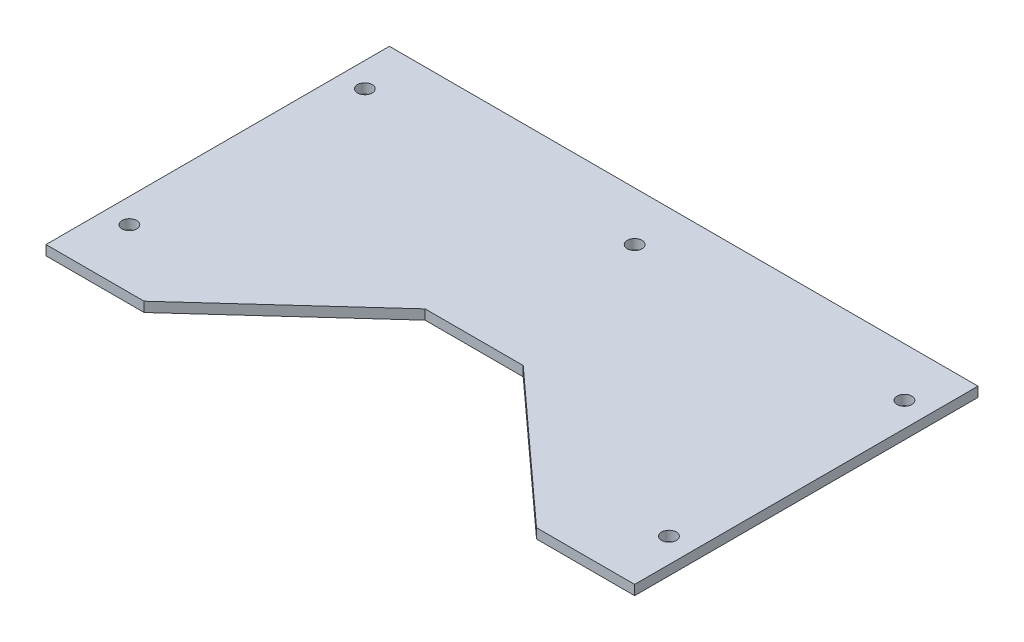
ISO-10303-21;
HEADER;
FILE_DESCRIPTION(('STEP AP214'),'2;1');
FILE_NAME('part.step','',(''),(''),'','','');
FILE_SCHEMA(('AUTOMOTIVE_DESIGN { 1 0 10303 214 1 1 1 1 }'));
ENDSEC;
DATA;
#1=APPLICATION_CONTEXT('core data for automotive mechanical design processes');
#2=APPLICATION_PROTOCOL_DEFINITION('international standard','automotive_design',2000,#1);
#3=PRODUCT_CONTEXT('',#1,'mechanical');
#4=PRODUCT('Part','Part','',(#3));
#5=PRODUCT_RELATED_PRODUCT_CATEGORY('part','',(#4));
#6=PRODUCT_DEFINITION_FORMATION('','',#4);
#7=PRODUCT_DEFINITION_CONTEXT('part definition',#1,'design');
#8=PRODUCT_DEFINITION('design','',#6,#7);
#9=PRODUCT_DEFINITION_SHAPE('','',#8);
#10=(LENGTH_UNIT() NAMED_UNIT(*) SI_UNIT(.MILLI.,.METRE.));
#11=(NAMED_UNIT(*) PLANE_ANGLE_UNIT() SI_UNIT($,.RADIAN.));
#12=(NAMED_UNIT(*) SI_UNIT($,.STERADIAN.) SOLID_ANGLE_UNIT());
#13=UNCERTAINTY_MEASURE_WITH_UNIT(LENGTH_MEASURE(1.E-05),#10,'distance_accuracy_value','');
#14=(GEOMETRIC_REPRESENTATION_CONTEXT(3) GLOBAL_UNCERTAINTY_ASSIGNED_CONTEXT((#13)) GLOBAL_UNIT_ASSIGNED_CONTEXT((#10,
#11,#12)) REPRESENTATION_CONTEXT('',''));
#15=CARTESIAN_POINT('',(0.,0.,0.));
#16=DIRECTION('',(0.,0.,1.));
#17=DIRECTION('',(1.,0.,0.));
#18=AXIS2_PLACEMENT_3D('',#15,#16,#17);
#19=CARTESIAN_POINT('',(0.,1.27,0.));
#20=DIRECTION('',(0.,-1.,0.));
#21=DIRECTION('',(0.,0.,-1.));
#22=AXIS2_PLACEMENT_3D('',#19,#20,#21);
#23=PLANE('',#22);
#24=CARTESIAN_POINT('',(69.85,1.27,33.8700806451613));
#25=DIRECTION('',(0.,1.,0.));
#26=DIRECTION('',(0.,0.,1.));
#27=AXIS2_PLACEMENT_3D('',#24,#25,#26);
#28=CIRCLE('',#27,1.90500000000001);
#29=CARTESIAN_POINT('',(69.85,1.27,35.7750806451613));
#30=VERTEX_POINT('',#29);
#31=EDGE_CURVE('E196',#30,#30,#28,.T.);
#32=ORIENTED_EDGE('',*,*,#31,.F.);
#33=EDGE_LOOP('',(#32));
#34=FACE_BOUND('',#33,.T.);
#35=CARTESIAN_POINT('',(0.,1.27,-27.0899193548382));
#36=DIRECTION('',(0.,1.,0.));
#37=DIRECTION('',(0.,0.,1.));
#38=AXIS2_PLACEMENT_3D('',#35,#36,#37);
#39=CIRCLE('',#38,1.90500000000001);
#40=CARTESIAN_POINT('',(0.,1.27,-25.1849193548382));
#41=VERTEX_POINT('',#40);
#42=EDGE_CURVE('E184',#41,#41,#39,.T.);
#43=ORIENTED_EDGE('',*,*,#42,.F.);
#44=EDGE_LOOP('',(#43));
#45=FACE_BOUND('',#44,.T.);
#46=DIRECTION('',(0.,0.,1.));
#47=VECTOR('',#46,1.);
#48=CARTESIAN_POINT('',(-76.2,1.27,49.1100806451613));
#49=LINE('',#48,#47);
#50=CARTESIAN_POINT('',(-76.2,1.27,-39.7899193548387));
#51=VERTEX_POINT('',#50);
#52=CARTESIAN_POINT('',(-76.2,1.27,49.1100806451613));
#53=VERTEX_POINT('',#52);
#54=EDGE_CURVE('E147',#51,#53,#49,.T.);
#55=ORIENTED_EDGE('',*,*,#54,.T.);
#56=DIRECTION('',(1.,0.,0.));
#57=VECTOR('',#56,1.);
#58=CARTESIAN_POINT('',(-50.8,1.27,49.1100806451613));
#59=LINE('',#58,#57);
#60=CARTESIAN_POINT('',(-50.8,1.27,49.1100806451613));
#61=VERTEX_POINT('',#60);
#62=EDGE_CURVE('E95',#53,#61,#59,.T.);
#63=ORIENTED_EDGE('',*,*,#62,.T.);
#64=DIRECTION('',(0.739790078910943,0.,-0.67283775098083));
#65=VECTOR('',#64,1.);
#66=CARTESIAN_POINT('',(-12.7,1.27,14.4581989247312));
#67=LINE('',#66,#65);
#68=CARTESIAN_POINT('',(-12.7,1.27,14.4581989247312));
#69=VERTEX_POINT('',#68);
#70=EDGE_CURVE('E162',#61,#69,#67,.T.);
#71=ORIENTED_EDGE('',*,*,#70,.T.);
#72=DIRECTION('',(1.,0.,0.));
#73=VECTOR('',#72,1.);
#74=CARTESIAN_POINT('',(12.7,1.27,14.4581989247312));
#75=LINE('',#74,#73);
#76=CARTESIAN_POINT('',(12.7,1.27,14.4581989247312));
#77=VERTEX_POINT('',#76);
#78=EDGE_CURVE('E175',#69,#77,#75,.T.);
#79=ORIENTED_EDGE('',*,*,#78,.T.);
#80=DIRECTION('',(0.739790078910943,0.,0.67283775098083));
#81=VECTOR('',#80,1.);
#82=CARTESIAN_POINT('',(50.8,1.27,49.1100806451613));
#83=LINE('',#82,#81);
#84=CARTESIAN_POINT('',(50.8,1.27,49.1100806451613));
#85=VERTEX_POINT('',#84);
#86=EDGE_CURVE('E114',#77,#85,#83,.T.);
#87=ORIENTED_EDGE('',*,*,#86,.T.);
#88=DIRECTION('',(1.,0.,0.));
#89=VECTOR('',#88,1.);
#90=CARTESIAN_POINT('',(76.2,1.27,49.1100806451613));
#91=LINE('',#90,#89);
#92=CARTESIAN_POINT('',(76.2,1.27,49.1100806451613));
#93=VERTEX_POINT('',#92);
#94=EDGE_CURVE('E108',#85,#93,#91,.T.);
#95=ORIENTED_EDGE('',*,*,#94,.T.);
#96=DIRECTION('',(0.,0.,-1.));
#97=VECTOR('',#96,1.);
#98=CARTESIAN_POINT('',(76.2,1.27,-39.7899193548387));
#99=LINE('',#98,#97);
#100=CARTESIAN_POINT('',(76.2,1.27,-39.7899193548387));
#101=VERTEX_POINT('',#100);
#102=EDGE_CURVE('E112',#93,#101,#99,.T.);
#103=ORIENTED_EDGE('',*,*,#102,.T.);
#104=DIRECTION('',(-1.,0.,0.));
#105=VECTOR('',#104,1.);
#106=CARTESIAN_POINT('',(-76.2,1.27,-39.7899193548387));
#107=LINE('',#106,#105);
#108=EDGE_CURVE('E52',#101,#51,#107,.T.);
#109=ORIENTED_EDGE('',*,*,#108,.T.);
#110=EDGE_LOOP('',(#55,#63,#71,#79,#87,#95,#103,#109));
#111=FACE_BOUND('',#110,.T.);
#112=CARTESIAN_POINT('',(69.85,1.27,-27.0899193548387));
#113=DIRECTION('',(0.,1.,0.));
#114=DIRECTION('',(0.,0.,1.));
#115=AXIS2_PLACEMENT_3D('',#112,#113,#114);
#116=CIRCLE('',#115,1.90500000000001);
#117=CARTESIAN_POINT('',(69.85,1.27,-25.1849193548387));
#118=VERTEX_POINT('',#117);
#119=EDGE_CURVE('E136',#118,#118,#116,.T.);
#120=ORIENTED_EDGE('',*,*,#119,.F.);
#121=EDGE_LOOP('',(#120));
#122=FACE_BOUND('',#121,.T.);
#123=CARTESIAN_POINT('',(-69.85,1.27,-27.0899193548377));
#124=DIRECTION('',(0.,1.,0.));
#125=DIRECTION('',(0.,0.,1.));
#126=AXIS2_PLACEMENT_3D('',#123,#124,#125);
#127=CIRCLE('',#126,1.90500000000001);
#128=CARTESIAN_POINT('',(-69.85,1.27,-25.1849193548377));
#129=VERTEX_POINT('',#128);
#130=EDGE_CURVE('E190',#129,#129,#127,.T.);
#131=ORIENTED_EDGE('',*,*,#130,.F.);
#132=EDGE_LOOP('',(#131));
#133=FACE_BOUND('',#132,.T.);
#134=CARTESIAN_POINT('',(-69.85,1.27,33.8700806451623));
#135=DIRECTION('',(0.,1.,0.));
#136=DIRECTION('',(0.,0.,1.));
#137=AXIS2_PLACEMENT_3D('',#134,#135,#136);
#138=CIRCLE('',#137,1.90500000000001);
#139=CARTESIAN_POINT('',(-69.85,1.27,35.7750806451623));
#140=VERTEX_POINT('',#139);
#141=EDGE_CURVE('E202',#140,#140,#138,.T.);
#142=ORIENTED_EDGE('',*,*,#141,.F.);
#143=EDGE_LOOP('',(#142));
#144=FACE_BOUND('',#143,.T.);
#145=ADVANCED_FACE('F35',(#34,#45,#111,#122,#133,#144),#23,.F.);
#146=CARTESIAN_POINT('',(0.,-1.27,0.));
#147=DIRECTION('',(0.,-1.,0.));
#148=DIRECTION('',(0.,0.,-1.));
#149=AXIS2_PLACEMENT_3D('',#146,#147,#148);
#150=PLANE('',#149);
#151=CARTESIAN_POINT('',(69.85,-1.27,33.8700806451613));
#152=DIRECTION('',(0.,1.,0.));
#153=DIRECTION('',(0.,0.,1.));
#154=AXIS2_PLACEMENT_3D('',#151,#152,#153);
#155=CIRCLE('',#154,1.90500000000001);
#156=CARTESIAN_POINT('',(69.85,-1.27,35.7750806451613));
#157=VERTEX_POINT('',#156);
#158=EDGE_CURVE('E199',#157,#157,#155,.T.);
#159=ORIENTED_EDGE('',*,*,#158,.T.);
#160=EDGE_LOOP('',(#159));
#161=FACE_BOUND('',#160,.T.);
#162=CARTESIAN_POINT('',(0.,-1.27,-27.0899193548382));
#163=DIRECTION('',(0.,1.,0.));
#164=DIRECTION('',(0.,0.,1.));
#165=AXIS2_PLACEMENT_3D('',#162,#163,#164);
#166=CIRCLE('',#165,1.90500000000001);
#167=CARTESIAN_POINT('',(0.,-1.27,-25.1849193548382));
#168=VERTEX_POINT('',#167);
#169=EDGE_CURVE('E187',#168,#168,#166,.T.);
#170=ORIENTED_EDGE('',*,*,#169,.T.);
#171=EDGE_LOOP('',(#170));
#172=FACE_BOUND('',#171,.T.);
#173=DIRECTION('',(0.,0.,1.));
#174=VECTOR('',#173,1.);
#175=CARTESIAN_POINT('',(-76.2,-1.27,49.1100806451613));
#176=LINE('',#175,#174);
#177=CARTESIAN_POINT('',(-76.2,-1.27,-39.7899193548387));
#178=VERTEX_POINT('',#177);
#179=CARTESIAN_POINT('',(-76.2,-1.27,49.1100806451613));
#180=VERTEX_POINT('',#179);
#181=EDGE_CURVE('E132',#178,#180,#176,.T.);
#182=ORIENTED_EDGE('',*,*,#181,.F.);
#183=DIRECTION('',(-1.,0.,0.));
#184=VECTOR('',#183,1.);
#185=CARTESIAN_POINT('',(-76.2,-1.27,-39.7899193548387));
#186=LINE('',#185,#184);
#187=CARTESIAN_POINT('',(76.2,-1.27,-39.7899193548387));
#188=VERTEX_POINT('',#187);
#189=EDGE_CURVE('E87',#188,#178,#186,.T.);
#190=ORIENTED_EDGE('',*,*,#189,.F.);
#191=DIRECTION('',(0.,0.,-1.));
#192=VECTOR('',#191,1.);
#193=CARTESIAN_POINT('',(76.2,-1.27,-39.7899193548387));
#194=LINE('',#193,#192);
#195=CARTESIAN_POINT('',(76.2,-1.27,49.1100806451613));
#196=VERTEX_POINT('',#195);
#197=EDGE_CURVE('E81',#196,#188,#194,.T.);
#198=ORIENTED_EDGE('',*,*,#197,.F.);
#199=DIRECTION('',(1.,0.,0.));
#200=VECTOR('',#199,1.);
#201=CARTESIAN_POINT('',(76.2,-1.27,49.1100806451613));
#202=LINE('',#201,#200);
#203=CARTESIAN_POINT('',(50.8,-1.27,49.1100806451613));
#204=VERTEX_POINT('',#203);
#205=EDGE_CURVE('E122',#204,#196,#202,.T.);
#206=ORIENTED_EDGE('',*,*,#205,.F.);
#207=DIRECTION('',(0.739790078910943,0.,0.67283775098083));
#208=VECTOR('',#207,1.);
#209=CARTESIAN_POINT('',(50.8,-1.27,49.1100806451613));
#210=LINE('',#209,#208);
#211=CARTESIAN_POINT('',(12.7,-1.27,14.4581989247312));
#212=VERTEX_POINT('',#211);
#213=EDGE_CURVE('E142',#212,#204,#210,.T.);
#214=ORIENTED_EDGE('',*,*,#213,.F.);
#215=DIRECTION('',(1.,0.,0.));
#216=VECTOR('',#215,1.);
#217=CARTESIAN_POINT('',(12.7,-1.27,14.4581989247312));
#218=LINE('',#217,#216);
#219=CARTESIAN_POINT('',(-12.7,-1.27,14.4581989247312));
#220=VERTEX_POINT('',#219);
#221=EDGE_CURVE('E140',#220,#212,#218,.T.);
#222=ORIENTED_EDGE('',*,*,#221,.F.);
#223=DIRECTION('',(0.739790078910943,0.,-0.67283775098083));
#224=VECTOR('',#223,1.);
#225=CARTESIAN_POINT('',(-12.7,-1.27,14.4581989247312));
#226=LINE('',#225,#224);
#227=CARTESIAN_POINT('',(-50.8,-1.27,49.1100806451613));
#228=VERTEX_POINT('',#227);
#229=EDGE_CURVE('E138',#228,#220,#226,.T.);
#230=ORIENTED_EDGE('',*,*,#229,.F.);
#231=DIRECTION('',(1.,0.,0.));
#232=VECTOR('',#231,1.);
#233=CARTESIAN_POINT('',(-50.8,-1.27,49.1100806451613));
#234=LINE('',#233,#232);
#235=EDGE_CURVE('E135',#180,#228,#234,.T.);
#236=ORIENTED_EDGE('',*,*,#235,.F.);
#237=EDGE_LOOP('',(#182,#190,#198,#206,#214,#222,#230,#236));
#238=FACE_BOUND('',#237,.T.);
#239=CARTESIAN_POINT('',(69.85,-1.27,-27.0899193548387));
#240=DIRECTION('',(0.,1.,0.));
#241=DIRECTION('',(0.,0.,1.));
#242=AXIS2_PLACEMENT_3D('',#239,#240,#241);
#243=CIRCLE('',#242,1.90500000000001);
#244=CARTESIAN_POINT('',(69.85,-1.27,-25.1849193548387));
#245=VERTEX_POINT('',#244);
#246=EDGE_CURVE('E181',#245,#245,#243,.T.);
#247=ORIENTED_EDGE('',*,*,#246,.T.);
#248=EDGE_LOOP('',(#247));
#249=FACE_BOUND('',#248,.T.);
#250=CARTESIAN_POINT('',(-69.85,-1.27,-27.0899193548377));
#251=DIRECTION('',(0.,1.,0.));
#252=DIRECTION('',(0.,0.,1.));
#253=AXIS2_PLACEMENT_3D('',#250,#251,#252);
#254=CIRCLE('',#253,1.90500000000001);
#255=CARTESIAN_POINT('',(-69.85,-1.27,-25.1849193548377));
#256=VERTEX_POINT('',#255);
#257=EDGE_CURVE('E193',#256,#256,#254,.T.);
#258=ORIENTED_EDGE('',*,*,#257,.T.);
#259=EDGE_LOOP('',(#258));
#260=FACE_BOUND('',#259,.T.);
#261=CARTESIAN_POINT('',(-69.85,-1.27,33.8700806451623));
#262=DIRECTION('',(0.,1.,0.));
#263=DIRECTION('',(0.,0.,1.));
#264=AXIS2_PLACEMENT_3D('',#261,#262,#263);
#265=CIRCLE('',#264,1.90500000000001);
#266=CARTESIAN_POINT('',(-69.85,-1.27,35.7750806451623));
#267=VERTEX_POINT('',#266);
#268=EDGE_CURVE('E205',#267,#267,#265,.T.);
#269=ORIENTED_EDGE('',*,*,#268,.T.);
#270=EDGE_LOOP('',(#269));
#271=FACE_BOUND('',#270,.T.);
#272=ADVANCED_FACE('F166',(#161,#172,#238,#249,#260,#271),#150,.T.);
#273=CARTESIAN_POINT('',(-76.2,1.27,49.1100806451613));
#274=DIRECTION('',(1.,0.,0.));
#275=DIRECTION('',(0.,0.,-1.));
#276=AXIS2_PLACEMENT_3D('',#273,#274,#275);
#277=PLANE('',#276);
#278=ORIENTED_EDGE('',*,*,#181,.T.);
#279=DIRECTION('',(0.,-1.,0.));
#280=VECTOR('',#279,1.);
#281=CARTESIAN_POINT('',(-76.2,1.27,49.1100806451613));
#282=LINE('',#281,#280);
#283=EDGE_CURVE('E11',#53,#180,#282,.T.);
#284=ORIENTED_EDGE('',*,*,#283,.F.);
#285=ORIENTED_EDGE('',*,*,#54,.F.);
#286=DIRECTION('',(0.,-1.,0.));
#287=VECTOR('',#286,1.);
#288=CARTESIAN_POINT('',(-76.2,1.27,-39.7899193548387));
#289=LINE('',#288,#287);
#290=EDGE_CURVE('E128',#51,#178,#289,.T.);
#291=ORIENTED_EDGE('',*,*,#290,.T.);
#292=EDGE_LOOP('',(#278,#284,#285,#291));
#293=FACE_BOUND('',#292,.T.);
#294=ADVANCED_FACE('F37',(#293),#277,.F.);
#295=CARTESIAN_POINT('',(-50.8,1.27,49.1100806451613));
#296=DIRECTION('',(0.,0.,-1.));
#297=DIRECTION('',(-1.,0.,0.));
#298=AXIS2_PLACEMENT_3D('',#295,#296,#297);
#299=PLANE('',#298);
#300=ORIENTED_EDGE('',*,*,#235,.T.);
#301=DIRECTION('',(0.,-1.,0.));
#302=VECTOR('',#301,1.);
#303=CARTESIAN_POINT('',(-50.8,1.27,49.1100806451613));
#304=LINE('',#303,#302);
#305=EDGE_CURVE('E44',#61,#228,#304,.T.);
#306=ORIENTED_EDGE('',*,*,#305,.F.);
#307=ORIENTED_EDGE('',*,*,#62,.F.);
#308=ORIENTED_EDGE('',*,*,#283,.T.);
#309=EDGE_LOOP('',(#300,#306,#307,#308));
#310=FACE_BOUND('',#309,.T.);
#311=ADVANCED_FACE('F240',(#310),#299,.F.);
#312=CARTESIAN_POINT('',(-12.7,1.27,14.4581989247312));
#313=DIRECTION('',(-0.67283775098083,0.,-0.739790078910942));
#314=DIRECTION('',(-0.739790078910942,0.,0.67283775098083));
#315=AXIS2_PLACEMENT_3D('',#312,#313,#314);
#316=PLANE('',#315);
#317=ORIENTED_EDGE('',*,*,#229,.T.);
#318=DIRECTION('',(0.,-1.,0.));
#319=VECTOR('',#318,1.);
#320=CARTESIAN_POINT('',(-12.7,1.27,14.4581989247312));
#321=LINE('',#320,#319);
#322=EDGE_CURVE('E154',#69,#220,#321,.T.);
#323=ORIENTED_EDGE('',*,*,#322,.F.);
#324=ORIENTED_EDGE('',*,*,#70,.F.);
#325=ORIENTED_EDGE('',*,*,#305,.T.);
#326=EDGE_LOOP('',(#317,#323,#324,#325));
#327=FACE_BOUND('',#326,.T.);
#328=ADVANCED_FACE('F160',(#327),#316,.F.);
#329=CARTESIAN_POINT('',(12.7,1.27,14.4581989247312));
#330=DIRECTION('',(0.,0.,-1.));
#331=DIRECTION('',(-1.,0.,0.));
#332=AXIS2_PLACEMENT_3D('',#329,#330,#331);
#333=PLANE('',#332);
#334=ORIENTED_EDGE('',*,*,#221,.T.);
#335=DIRECTION('',(0.,-1.,0.));
#336=VECTOR('',#335,1.);
#337=CARTESIAN_POINT('',(12.7,1.27,14.4581989247312));
#338=LINE('',#337,#336);
#339=EDGE_CURVE('E151',#77,#212,#338,.T.);
#340=ORIENTED_EDGE('',*,*,#339,.F.);
#341=ORIENTED_EDGE('',*,*,#78,.F.);
#342=ORIENTED_EDGE('',*,*,#322,.T.);
#343=EDGE_LOOP('',(#334,#340,#341,#342));
#344=FACE_BOUND('',#343,.T.);
#345=ADVANCED_FACE('F171',(#344),#333,.F.);
#346=CARTESIAN_POINT('',(50.8,1.27,49.1100806451613));
#347=DIRECTION('',(0.67283775098083,0.,-0.739790078910942));
#348=DIRECTION('',(-0.739790078910942,0.,-0.67283775098083));
#349=AXIS2_PLACEMENT_3D('',#346,#347,#348);
#350=PLANE('',#349);
#351=ORIENTED_EDGE('',*,*,#213,.T.);
#352=DIRECTION('',(0.,-1.,0.));
#353=VECTOR('',#352,1.);
#354=CARTESIAN_POINT('',(50.8,1.27,49.1100806451613));
#355=LINE('',#354,#353);
#356=EDGE_CURVE('E123',#85,#204,#355,.T.);
#357=ORIENTED_EDGE('',*,*,#356,.F.);
#358=ORIENTED_EDGE('',*,*,#86,.F.);
#359=ORIENTED_EDGE('',*,*,#339,.T.);
#360=EDGE_LOOP('',(#351,#357,#358,#359));
#361=FACE_BOUND('',#360,.T.);
#362=ADVANCED_FACE('F174',(#361),#350,.F.);
#363=CARTESIAN_POINT('',(76.2,1.27,49.1100806451613));
#364=DIRECTION('',(0.,0.,-1.));
#365=DIRECTION('',(-1.,0.,0.));
#366=AXIS2_PLACEMENT_3D('',#363,#364,#365);
#367=PLANE('',#366);
#368=ORIENTED_EDGE('',*,*,#205,.T.);
#369=DIRECTION('',(0.,-1.,0.));
#370=VECTOR('',#369,1.);
#371=CARTESIAN_POINT('',(76.2,1.27,49.1100806451613));
#372=LINE('',#371,#370);
#373=EDGE_CURVE('E119',#93,#196,#372,.T.);
#374=ORIENTED_EDGE('',*,*,#373,.F.);
#375=ORIENTED_EDGE('',*,*,#94,.F.);
#376=ORIENTED_EDGE('',*,*,#356,.T.);
#377=EDGE_LOOP('',(#368,#374,#375,#376));
#378=FACE_BOUND('',#377,.T.);
#379=ADVANCED_FACE('F120',(#378),#367,.F.);
#380=CARTESIAN_POINT('',(76.2,1.27,-39.7899193548387));
#381=DIRECTION('',(-1.,0.,0.));
#382=DIRECTION('',(0.,0.,1.));
#383=AXIS2_PLACEMENT_3D('',#380,#381,#382);
#384=PLANE('',#383);
#385=ORIENTED_EDGE('',*,*,#197,.T.);
#386=DIRECTION('',(0.,-1.,0.));
#387=VECTOR('',#386,1.);
#388=CARTESIAN_POINT('',(76.2,1.27,-39.7899193548387));
#389=LINE('',#388,#387);
#390=EDGE_CURVE('E124',#101,#188,#389,.T.);
#391=ORIENTED_EDGE('',*,*,#390,.F.);
#392=ORIENTED_EDGE('',*,*,#102,.F.);
#393=ORIENTED_EDGE('',*,*,#373,.T.);
#394=EDGE_LOOP('',(#385,#391,#392,#393));
#395=FACE_BOUND('',#394,.T.);
#396=ADVANCED_FACE('F126',(#395),#384,.F.);
#397=CARTESIAN_POINT('',(-76.2,1.27,-39.7899193548387));
#398=DIRECTION('',(0.,0.,1.));
#399=DIRECTION('',(1.,0.,0.));
#400=AXIS2_PLACEMENT_3D('',#397,#398,#399);
#401=PLANE('',#400);
#402=ORIENTED_EDGE('',*,*,#189,.T.);
#403=ORIENTED_EDGE('',*,*,#290,.F.);
#404=ORIENTED_EDGE('',*,*,#108,.F.);
#405=ORIENTED_EDGE('',*,*,#390,.T.);
#406=EDGE_LOOP('',(#402,#403,#404,#405));
#407=FACE_BOUND('',#406,.T.);
#408=ADVANCED_FACE('F228',(#407),#401,.F.);
#409=CARTESIAN_POINT('',(69.85,1.27,-27.0899193548387));
#410=DIRECTION('',(0.,-1.,0.));
#411=DIRECTION('',(0.,0.,-1.));
#412=AXIS2_PLACEMENT_3D('',#409,#410,#411);
#413=CYLINDRICAL_SURFACE('',#412,1.90500000000001);
#414=ORIENTED_EDGE('',*,*,#119,.T.);
#415=EDGE_LOOP('',(#414));
#416=FACE_BOUND('',#415,.T.);
#417=ORIENTED_EDGE('',*,*,#246,.F.);
#418=EDGE_LOOP('',(#417));
#419=FACE_BOUND('',#418,.T.);
#420=ADVANCED_FACE('F225',(#416,#419),#413,.F.);
#421=CARTESIAN_POINT('',(0.,1.27,-27.0899193548382));
#422=DIRECTION('',(0.,-1.,0.));
#423=DIRECTION('',(0.,0.,-1.));
#424=AXIS2_PLACEMENT_3D('',#421,#422,#423);
#425=CYLINDRICAL_SURFACE('',#424,1.90500000000001);
#426=ORIENTED_EDGE('',*,*,#42,.T.);
#427=EDGE_LOOP('',(#426));
#428=FACE_BOUND('',#427,.T.);
#429=ORIENTED_EDGE('',*,*,#169,.F.);
#430=EDGE_LOOP('',(#429));
#431=FACE_BOUND('',#430,.T.);
#432=ADVANCED_FACE('F304',(#428,#431),#425,.F.);
#433=CARTESIAN_POINT('',(-69.85,1.27,-27.0899193548377));
#434=DIRECTION('',(0.,-1.,0.));
#435=DIRECTION('',(0.,0.,-1.));
#436=AXIS2_PLACEMENT_3D('',#433,#434,#435);
#437=CYLINDRICAL_SURFACE('',#436,1.90500000000001);
#438=ORIENTED_EDGE('',*,*,#130,.T.);
#439=EDGE_LOOP('',(#438));
#440=FACE_BOUND('',#439,.T.);
#441=ORIENTED_EDGE('',*,*,#257,.F.);
#442=EDGE_LOOP('',(#441));
#443=FACE_BOUND('',#442,.T.);
#444=ADVANCED_FACE('F312',(#440,#443),#437,.F.);
#445=CARTESIAN_POINT('',(69.85,1.27,33.8700806451613));
#446=DIRECTION('',(0.,-1.,0.));
#447=DIRECTION('',(0.,0.,-1.));
#448=AXIS2_PLACEMENT_3D('',#445,#446,#447);
#449=CYLINDRICAL_SURFACE('',#448,1.90500000000001);
#450=ORIENTED_EDGE('',*,*,#31,.T.);
#451=EDGE_LOOP('',(#450));
#452=FACE_BOUND('',#451,.T.);
#453=ORIENTED_EDGE('',*,*,#158,.F.);
#454=EDGE_LOOP('',(#453));
#455=FACE_BOUND('',#454,.T.);
#456=ADVANCED_FACE('F320',(#452,#455),#449,.F.);
#457=CARTESIAN_POINT('',(-69.85,1.27,33.8700806451623));
#458=DIRECTION('',(0.,-1.,0.));
#459=DIRECTION('',(0.,0.,-1.));
#460=AXIS2_PLACEMENT_3D('',#457,#458,#459);
#461=CYLINDRICAL_SURFACE('',#460,1.90500000000001);
#462=ORIENTED_EDGE('',*,*,#141,.T.);
#463=EDGE_LOOP('',(#462));
#464=FACE_BOUND('',#463,.T.);
#465=ORIENTED_EDGE('',*,*,#268,.F.);
#466=EDGE_LOOP('',(#465));
#467=FACE_BOUND('',#466,.T.);
#468=ADVANCED_FACE('F211',(#464,#467),#461,.F.);
#469=CLOSED_SHELL('',(#145,#272,#294,#311,#328,#345,#362,#379,#396,#408,#420,#432,#444,#456,#468));
#470=MANIFOLD_SOLID_BREP('B2',#469);
#471=ADVANCED_BREP_SHAPE_REPRESENTATION('',(#18,#470),#14);
#472=SHAPE_DEFINITION_REPRESENTATION(#9,#471);
ENDSEC;
END-ISO-10303-21;
